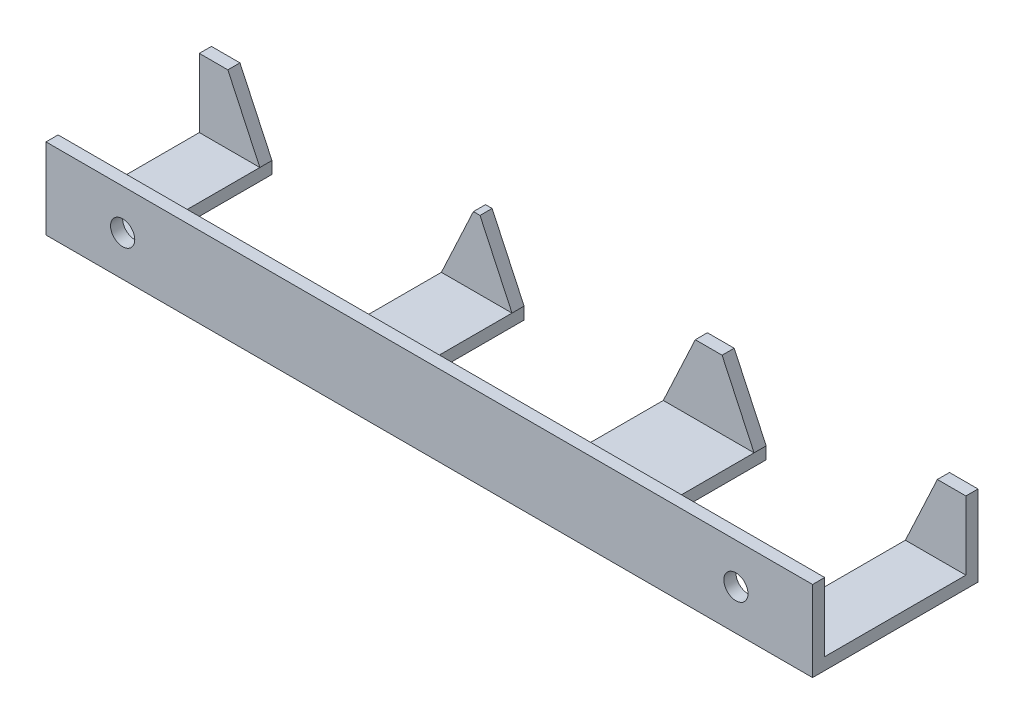
ISO-10303-21;
HEADER;
FILE_DESCRIPTION(('STEP AP214'),'2;1');
FILE_NAME('part.step','',(''),(''),'','','');
FILE_SCHEMA(('AUTOMOTIVE_DESIGN { 1 0 10303 214 1 1 1 1 }'));
ENDSEC;
DATA;
#1=APPLICATION_CONTEXT('core data for automotive mechanical design processes');
#2=APPLICATION_PROTOCOL_DEFINITION('international standard','automotive_design',2000,#1);
#3=PRODUCT_CONTEXT('',#1,'mechanical');
#4=PRODUCT('Part','Part','',(#3));
#5=PRODUCT_RELATED_PRODUCT_CATEGORY('part','',(#4));
#6=PRODUCT_DEFINITION_FORMATION('','',#4);
#7=PRODUCT_DEFINITION_CONTEXT('part definition',#1,'design');
#8=PRODUCT_DEFINITION('design','',#6,#7);
#9=PRODUCT_DEFINITION_SHAPE('','',#8);
#10=(LENGTH_UNIT() NAMED_UNIT(*) SI_UNIT(.MILLI.,.METRE.));
#11=(NAMED_UNIT(*) PLANE_ANGLE_UNIT() SI_UNIT($,.RADIAN.));
#12=(NAMED_UNIT(*) SI_UNIT($,.STERADIAN.) SOLID_ANGLE_UNIT());
#13=UNCERTAINTY_MEASURE_WITH_UNIT(LENGTH_MEASURE(1.E-05),#10,'distance_accuracy_value','');
#14=(GEOMETRIC_REPRESENTATION_CONTEXT(3) GLOBAL_UNCERTAINTY_ASSIGNED_CONTEXT((#13)) GLOBAL_UNIT_ASSIGNED_CONTEXT((#10,
#11,#12)) REPRESENTATION_CONTEXT('',''));
#15=CARTESIAN_POINT('',(0.,0.,0.));
#16=DIRECTION('',(0.,0.,1.));
#17=DIRECTION('',(1.,0.,0.));
#18=AXIS2_PLACEMENT_3D('',#15,#16,#17);
#19=CARTESIAN_POINT('',(-95.,10.,41.));
#20=DIRECTION('',(0.,-1.,0.));
#21=DIRECTION('',(0.,0.,-1.));
#22=AXIS2_PLACEMENT_3D('',#19,#20,#21);
#23=PLANE('',#22);
#24=DIRECTION('',(1.,0.,0.));
#25=VECTOR('',#24,1.);
#26=CARTESIAN_POINT('',(0.,10.,3.));
#27=LINE('',#26,#25);
#28=CARTESIAN_POINT('',(27.927230188635,10.,3.));
#29=VERTEX_POINT('',#28);
#30=CARTESIAN_POINT('',(34.572769811365,10.,3.));
#31=VERTEX_POINT('',#30);
#32=EDGE_CURVE('E454',#29,#31,#27,.T.);
#33=ORIENTED_EDGE('',*,*,#32,.T.);
#34=DIRECTION('',(0.,0.,-1.));
#35=VECTOR('',#34,1.);
#36=CARTESIAN_POINT('',(34.572769811365,10.,41.));
#37=LINE('',#36,#35);
#38=CARTESIAN_POINT('',(34.572769811365,10.,0.));
#39=VERTEX_POINT('',#38);
#40=EDGE_CURVE('E438',#31,#39,#37,.T.);
#41=ORIENTED_EDGE('',*,*,#40,.T.);
#42=DIRECTION('',(-1.,0.,0.));
#43=VECTOR('',#42,1.);
#44=CARTESIAN_POINT('',(-95.,10.,0.));
#45=LINE('',#44,#43);
#46=CARTESIAN_POINT('',(27.927230188635,10.,0.));
#47=VERTEX_POINT('',#46);
#48=EDGE_CURVE('E348',#39,#47,#45,.T.);
#49=ORIENTED_EDGE('',*,*,#48,.T.);
#50=DIRECTION('',(0.,0.,1.));
#51=VECTOR('',#50,1.);
#52=CARTESIAN_POINT('',(27.927230188635,10.,41.));
#53=LINE('',#52,#51);
#54=EDGE_CURVE('E407',#47,#29,#53,.T.);
#55=ORIENTED_EDGE('',*,*,#54,.T.);
#56=EDGE_LOOP('',(#33,#41,#49,#55));
#57=FACE_BOUND('',#56,.T.);
#58=ADVANCED_FACE('F33',(#57),#23,.F.);
#59=CARTESIAN_POINT('',(-27.0727698113651,10.,3.));
#60=VERTEX_POINT('',#59);
#61=CARTESIAN_POINT('',(-25.427230188635,10.,3.));
#62=VERTEX_POINT('',#61);
#63=EDGE_CURVE('E318',#60,#62,#27,.T.);
#64=ORIENTED_EDGE('',*,*,#63,.T.);
#65=DIRECTION('',(0.,0.,-1.));
#66=VECTOR('',#65,1.);
#67=CARTESIAN_POINT('',(-25.427230188635,10.,41.));
#68=LINE('',#67,#66);
#69=CARTESIAN_POINT('',(-25.427230188635,10.,0.));
#70=VERTEX_POINT('',#69);
#71=EDGE_CURVE('E429',#62,#70,#68,.T.);
#72=ORIENTED_EDGE('',*,*,#71,.T.);
#73=CARTESIAN_POINT('',(-27.0727698113651,10.,0.));
#74=VERTEX_POINT('',#73);
#75=EDGE_CURVE('E457',#70,#74,#45,.T.);
#76=ORIENTED_EDGE('',*,*,#75,.T.);
#77=DIRECTION('',(0.,0.,1.));
#78=VECTOR('',#77,1.);
#79=CARTESIAN_POINT('',(-27.0727698113651,10.,41.));
#80=LINE('',#79,#78);
#81=EDGE_CURVE('E398',#74,#60,#80,.T.);
#82=ORIENTED_EDGE('',*,*,#81,.T.);
#83=EDGE_LOOP('',(#64,#72,#76,#82));
#84=FACE_BOUND('',#83,.T.);
#85=ADVANCED_FACE('F524',(#84),#23,.F.);
#86=CARTESIAN_POINT('',(0.,0.,0.));
#87=DIRECTION('',(0.,0.,1.));
#88=DIRECTION('',(1.,0.,0.));
#89=AXIS2_PLACEMENT_3D('',#86,#87,#88);
#90=PLANE('',#89);
#91=ORIENTED_EDGE('',*,*,#48,.F.);
#92=DIRECTION('',(-0.422618261740696,0.906307787036652,0.));
#93=VECTOR('',#92,1.);
#94=CARTESIAN_POINT('',(34.572769811365,10.,0.));
#95=LINE('',#94,#93);
#96=CARTESIAN_POINT('',(42.5,-7.00000000000021,0.));
#97=VERTEX_POINT('',#96);
#98=EDGE_CURVE('E48',#39,#97,#95,.F.);
#99=ORIENTED_EDGE('',*,*,#98,.T.);
#100=DIRECTION('',(0.,1.,0.));
#101=VECTOR('',#100,1.);
#102=CARTESIAN_POINT('',(42.5,-10.,0.));
#103=LINE('',#102,#101);
#104=CARTESIAN_POINT('',(42.5,-10.,0.));
#105=VERTEX_POINT('',#104);
#106=EDGE_CURVE('E281',#105,#97,#103,.T.);
#107=ORIENTED_EDGE('',*,*,#106,.F.);
#108=DIRECTION('',(1.,0.,0.));
#109=VECTOR('',#108,1.);
#110=CARTESIAN_POINT('',(-95.,-10.,0.));
#111=LINE('',#110,#109);
#112=CARTESIAN_POINT('',(20.,-10.,0.));
#113=VERTEX_POINT('',#112);
#114=EDGE_CURVE('E354',#113,#105,#111,.T.);
#115=ORIENTED_EDGE('',*,*,#114,.F.);
#116=DIRECTION('',(0.,-1.,0.));
#117=VECTOR('',#116,1.);
#118=CARTESIAN_POINT('',(20.,-10.,0.));
#119=LINE('',#118,#117);
#120=CARTESIAN_POINT('',(20.,-7.00000000000015,0.));
#121=VERTEX_POINT('',#120);
#122=EDGE_CURVE('E243',#121,#113,#119,.T.);
#123=ORIENTED_EDGE('',*,*,#122,.F.);
#124=DIRECTION('',(-0.422618261740697,-0.906307787036651,0.));
#125=VECTOR('',#124,1.);
#126=CARTESIAN_POINT('',(20.,-7.00000000000015,0.));
#127=LINE('',#126,#125);
#128=EDGE_CURVE('E404',#121,#47,#127,.F.);
#129=ORIENTED_EDGE('',*,*,#128,.T.);
#130=EDGE_LOOP('',(#91,#99,#107,#115,#123,#129));
#131=FACE_BOUND('',#130,.T.);
#132=ADVANCED_FACE('F455',(#131),#90,.F.);
#133=ORIENTED_EDGE('',*,*,#75,.F.);
#134=DIRECTION('',(-0.422618261740697,0.906307787036651,0.));
#135=VECTOR('',#134,1.);
#136=CARTESIAN_POINT('',(-25.427230188635,10.,0.));
#137=LINE('',#136,#135);
#138=CARTESIAN_POINT('',(-17.5,-7.00000000000018,0.));
#139=VERTEX_POINT('',#138);
#140=EDGE_CURVE('E432',#70,#139,#137,.F.);
#141=ORIENTED_EDGE('',*,*,#140,.T.);
#142=DIRECTION('',(0.,1.,0.));
#143=VECTOR('',#142,1.);
#144=CARTESIAN_POINT('',(-17.5,-10.,0.));
#145=LINE('',#144,#143);
#146=CARTESIAN_POINT('',(-17.5,-10.,0.));
#147=VERTEX_POINT('',#146);
#148=EDGE_CURVE('E236',#147,#139,#145,.T.);
#149=ORIENTED_EDGE('',*,*,#148,.F.);
#150=CARTESIAN_POINT('',(-35.,-10.,0.));
#151=VERTEX_POINT('',#150);
#152=EDGE_CURVE('E353',#151,#147,#111,.T.);
#153=ORIENTED_EDGE('',*,*,#152,.F.);
#154=DIRECTION('',(0.,-1.,0.));
#155=VECTOR('',#154,1.);
#156=CARTESIAN_POINT('',(-35.,-10.,0.));
#157=LINE('',#156,#155);
#158=CARTESIAN_POINT('',(-35.,-7.00000000000012,0.));
#159=VERTEX_POINT('',#158);
#160=EDGE_CURVE('E270',#159,#151,#157,.T.);
#161=ORIENTED_EDGE('',*,*,#160,.F.);
#162=DIRECTION('',(-0.422618261740697,-0.906307787036651,0.));
#163=VECTOR('',#162,1.);
#164=CARTESIAN_POINT('',(-35.,-7.00000000000012,0.));
#165=LINE('',#164,#163);
#166=EDGE_CURVE('E395',#159,#74,#165,.F.);
#167=ORIENTED_EDGE('',*,*,#166,.T.);
#168=EDGE_LOOP('',(#133,#141,#149,#153,#161,#167));
#169=FACE_BOUND('',#168,.T.);
#170=ADVANCED_FACE('F549',(#169),#90,.F.);
#171=CARTESIAN_POINT('',(0.,-7.,3.));
#172=DIRECTION('',(0.,0.,1.));
#173=DIRECTION('',(1.,0.,0.));
#174=AXIS2_PLACEMENT_3D('',#171,#172,#173);
#175=PLANE('',#174);
#176=DIRECTION('',(1.,0.,0.));
#177=VECTOR('',#176,1.);
#178=CARTESIAN_POINT('',(0.,-7.,3.));
#179=LINE('',#178,#177);
#180=CARTESIAN_POINT('',(20.,-7.,3.));
#181=VERTEX_POINT('',#180);
#182=CARTESIAN_POINT('',(42.5,-7.,3.));
#183=VERTEX_POINT('',#182);
#184=EDGE_CURVE('E313',#181,#183,#179,.T.);
#185=ORIENTED_EDGE('',*,*,#184,.T.);
#186=DIRECTION('',(0.422618261740696,-0.906307787036652,0.));
#187=VECTOR('',#186,1.);
#188=CARTESIAN_POINT('',(34.909236705839,9.27844441627814,3.));
#189=LINE('',#188,#187);
#190=EDGE_CURVE('E11',#183,#31,#189,.F.);
#191=ORIENTED_EDGE('',*,*,#190,.T.);
#192=ORIENTED_EDGE('',*,*,#32,.F.);
#193=DIRECTION('',(0.422618261740697,0.906307787036651,0.));
#194=VECTOR('',#193,1.);
#195=CARTESIAN_POINT('',(16.4278760968655,-14.6604444311898,3.));
#196=LINE('',#195,#194);
#197=EDGE_CURVE('E409',#29,#181,#196,.F.);
#198=ORIENTED_EDGE('',*,*,#197,.T.);
#199=EDGE_LOOP('',(#185,#191,#192,#198));
#200=FACE_BOUND('',#199,.T.);
#201=ADVANCED_FACE('F447',(#200),#175,.T.);
#202=CARTESIAN_POINT('',(-35.,-7.,3.));
#203=VERTEX_POINT('',#202);
#204=CARTESIAN_POINT('',(-17.5,-7.,3.));
#205=VERTEX_POINT('',#204);
#206=EDGE_CURVE('E312',#203,#205,#179,.T.);
#207=ORIENTED_EDGE('',*,*,#206,.T.);
#208=DIRECTION('',(0.422618261740697,-0.906307787036651,0.));
#209=VECTOR('',#208,1.);
#210=CARTESIAN_POINT('',(-14.3743915847573,-13.7028888772911,3.));
#211=LINE('',#210,#209);
#212=EDGE_CURVE('E436',#205,#62,#211,.F.);
#213=ORIENTED_EDGE('',*,*,#212,.T.);
#214=ORIENTED_EDGE('',*,*,#63,.F.);
#215=DIRECTION('',(0.422618261740697,0.906307787036651,0.));
#216=VECTOR('',#215,1.);
#217=CARTESIAN_POINT('',(-28.7487831695145,6.40577775458203,3.));
#218=LINE('',#217,#216);
#219=EDGE_CURVE('E400',#60,#203,#218,.F.);
#220=ORIENTED_EDGE('',*,*,#219,.T.);
#221=EDGE_LOOP('',(#207,#213,#214,#220));
#222=FACE_BOUND('',#221,.T.);
#223=ADVANCED_FACE('F522',(#222),#175,.T.);
#224=CARTESIAN_POINT('',(0.,-7.,0.));
#225=DIRECTION('',(0.,1.,0.));
#226=DIRECTION('',(0.,0.,1.));
#227=AXIS2_PLACEMENT_3D('',#224,#225,#226);
#228=PLANE('',#227);
#229=DIRECTION('',(0.,0.,-1.));
#230=VECTOR('',#229,1.);
#231=CARTESIAN_POINT('',(20.,-7.,0.));
#232=LINE('',#231,#230);
#233=CARTESIAN_POINT('',(20.,-7.,38.));
#234=VERTEX_POINT('',#233);
#235=EDGE_CURVE('E383',#234,#181,#232,.T.);
#236=ORIENTED_EDGE('',*,*,#235,.F.);
#237=DIRECTION('',(1.,0.,0.));
#238=VECTOR('',#237,1.);
#239=CARTESIAN_POINT('',(0.,-7.,38.));
#240=LINE('',#239,#238);
#241=CARTESIAN_POINT('',(42.5,-7.,38.));
#242=VERTEX_POINT('',#241);
#243=EDGE_CURVE('E232',#234,#242,#240,.T.);
#244=ORIENTED_EDGE('',*,*,#243,.T.);
#245=DIRECTION('',(0.,0.,1.));
#246=VECTOR('',#245,1.);
#247=CARTESIAN_POINT('',(42.5,-7.,0.));
#248=LINE('',#247,#246);
#249=EDGE_CURVE('E368',#183,#242,#248,.T.);
#250=ORIENTED_EDGE('',*,*,#249,.F.);
#251=ORIENTED_EDGE('',*,*,#184,.F.);
#252=EDGE_LOOP('',(#236,#244,#250,#251));
#253=FACE_BOUND('',#252,.T.);
#254=ADVANCED_FACE('F451',(#253),#228,.T.);
#255=DIRECTION('',(0.,0.,1.));
#256=VECTOR('',#255,1.);
#257=CARTESIAN_POINT('',(-17.5,-7.,0.));
#258=LINE('',#257,#256);
#259=CARTESIAN_POINT('',(-17.5,-7.,38.));
#260=VERTEX_POINT('',#259);
#261=EDGE_CURVE('E380',#205,#260,#258,.T.);
#262=ORIENTED_EDGE('',*,*,#261,.F.);
#263=ORIENTED_EDGE('',*,*,#206,.F.);
#264=DIRECTION('',(0.,0.,-1.));
#265=VECTOR('',#264,1.);
#266=CARTESIAN_POINT('',(-35.,-7.,0.));
#267=LINE('',#266,#265);
#268=CARTESIAN_POINT('',(-35.,-7.,38.));
#269=VERTEX_POINT('',#268);
#270=EDGE_CURVE('E377',#269,#203,#267,.T.);
#271=ORIENTED_EDGE('',*,*,#270,.F.);
#272=EDGE_CURVE('E304',#269,#260,#240,.T.);
#273=ORIENTED_EDGE('',*,*,#272,.T.);
#274=EDGE_LOOP('',(#262,#263,#271,#273));
#275=FACE_BOUND('',#274,.T.);
#276=ADVANCED_FACE('F507',(#275),#228,.T.);
#277=CARTESIAN_POINT('',(95.,10.,0.));
#278=VERTEX_POINT('',#277);
#279=CARTESIAN_POINT('',(87.927230188635,10.,0.));
#280=VERTEX_POINT('',#279);
#281=EDGE_CURVE('E344',#278,#280,#45,.T.);
#282=ORIENTED_EDGE('',*,*,#281,.T.);
#283=DIRECTION('',(0.,0.,1.));
#284=VECTOR('',#283,1.);
#285=CARTESIAN_POINT('',(87.927230188635,10.,41.));
#286=LINE('',#285,#284);
#287=CARTESIAN_POINT('',(87.927230188635,10.,3.));
#288=VERTEX_POINT('',#287);
#289=EDGE_CURVE('E416',#280,#288,#286,.T.);
#290=ORIENTED_EDGE('',*,*,#289,.T.);
#291=CARTESIAN_POINT('',(95.,10.,3.));
#292=VERTEX_POINT('',#291);
#293=EDGE_CURVE('E315',#288,#292,#27,.T.);
#294=ORIENTED_EDGE('',*,*,#293,.T.);
#295=DIRECTION('',(0.,0.,-1.));
#296=VECTOR('',#295,1.);
#297=CARTESIAN_POINT('',(95.,10.,41.));
#298=LINE('',#297,#296);
#299=EDGE_CURVE('E364',#292,#278,#298,.T.);
#300=ORIENTED_EDGE('',*,*,#299,.T.);
#301=EDGE_LOOP('',(#282,#290,#294,#300));
#302=FACE_BOUND('',#301,.T.);
#303=ADVANCED_FACE('F528',(#302),#23,.F.);
#304=DIRECTION('',(0.,-1.,0.));
#305=VECTOR('',#304,1.);
#306=CARTESIAN_POINT('',(80.,-10.,0.));
#307=LINE('',#306,#305);
#308=CARTESIAN_POINT('',(80.,-7.00000000000012,0.));
#309=VERTEX_POINT('',#308);
#310=CARTESIAN_POINT('',(80.,-10.,0.));
#311=VERTEX_POINT('',#310);
#312=EDGE_CURVE('E259',#309,#311,#307,.T.);
#313=ORIENTED_EDGE('',*,*,#312,.F.);
#314=DIRECTION('',(-0.422618261740697,-0.906307787036651,0.));
#315=VECTOR('',#314,1.);
#316=CARTESIAN_POINT('',(80.,-7.00000000000012,0.));
#317=LINE('',#316,#315);
#318=EDGE_CURVE('E414',#309,#280,#317,.F.);
#319=ORIENTED_EDGE('',*,*,#318,.T.);
#320=ORIENTED_EDGE('',*,*,#281,.F.);
#321=DIRECTION('',(0.,1.,0.));
#322=VECTOR('',#321,1.);
#323=CARTESIAN_POINT('',(95.,10.,0.));
#324=LINE('',#323,#322);
#325=CARTESIAN_POINT('',(95.,-10.,0.));
#326=VERTEX_POINT('',#325);
#327=EDGE_CURVE('E322',#326,#278,#324,.T.);
#328=ORIENTED_EDGE('',*,*,#327,.F.);
#329=EDGE_CURVE('E350',#311,#326,#111,.T.);
#330=ORIENTED_EDGE('',*,*,#329,.F.);
#331=EDGE_LOOP('',(#313,#319,#320,#328,#330));
#332=FACE_BOUND('',#331,.T.);
#333=ADVANCED_FACE('F538',(#332),#90,.F.);
#334=ORIENTED_EDGE('',*,*,#293,.F.);
#335=DIRECTION('',(0.422618261740697,0.906307787036651,0.));
#336=VECTOR('',#335,1.);
#337=CARTESIAN_POINT('',(65.7115043874617,-37.641777724759,3.));
#338=LINE('',#337,#336);
#339=CARTESIAN_POINT('',(80.,-7.,3.));
#340=VERTEX_POINT('',#339);
#341=EDGE_CURVE('E418',#288,#340,#338,.F.);
#342=ORIENTED_EDGE('',*,*,#341,.T.);
#343=CARTESIAN_POINT('',(95.,-7.,3.));
#344=VERTEX_POINT('',#343);
#345=EDGE_CURVE('E307',#340,#344,#179,.T.);
#346=ORIENTED_EDGE('',*,*,#345,.T.);
#347=DIRECTION('',(0.,1.,0.));
#348=VECTOR('',#347,1.);
#349=CARTESIAN_POINT('',(95.,-7.,3.));
#350=LINE('',#349,#348);
#351=EDGE_CURVE('E323',#344,#292,#350,.T.);
#352=ORIENTED_EDGE('',*,*,#351,.T.);
#353=EDGE_LOOP('',(#334,#342,#346,#352));
#354=FACE_BOUND('',#353,.T.);
#355=ADVANCED_FACE('F533',(#354),#175,.T.);
#356=DIRECTION('',(0.,0.,-1.));
#357=VECTOR('',#356,1.);
#358=CARTESIAN_POINT('',(80.,-7.,0.));
#359=LINE('',#358,#357);
#360=CARTESIAN_POINT('',(80.,-7.,38.));
#361=VERTEX_POINT('',#360);
#362=EDGE_CURVE('E371',#361,#340,#359,.T.);
#363=ORIENTED_EDGE('',*,*,#362,.F.);
#364=CARTESIAN_POINT('',(95.,-7.,38.));
#365=VERTEX_POINT('',#364);
#366=EDGE_CURVE('E298',#361,#365,#240,.T.);
#367=ORIENTED_EDGE('',*,*,#366,.T.);
#368=DIRECTION('',(0.,0.,-1.));
#369=VECTOR('',#368,1.);
#370=CARTESIAN_POINT('',(95.,-7.,0.));
#371=LINE('',#370,#369);
#372=EDGE_CURVE('E303',#365,#344,#371,.T.);
#373=ORIENTED_EDGE('',*,*,#372,.T.);
#374=ORIENTED_EDGE('',*,*,#345,.F.);
#375=EDGE_LOOP('',(#363,#367,#373,#374));
#376=FACE_BOUND('',#375,.T.);
#377=ADVANCED_FACE('F500',(#376),#228,.T.);
#378=CARTESIAN_POINT('',(95.,10.,41.));
#379=DIRECTION('',(-1.,0.,0.));
#380=DIRECTION('',(0.,0.,1.));
#381=AXIS2_PLACEMENT_3D('',#378,#379,#380);
#382=PLANE('',#381);
#383=ORIENTED_EDGE('',*,*,#351,.F.);
#384=ORIENTED_EDGE('',*,*,#372,.F.);
#385=DIRECTION('',(0.,1.,0.));
#386=VECTOR('',#385,1.);
#387=CARTESIAN_POINT('',(95.,-7.,38.));
#388=LINE('',#387,#386);
#389=CARTESIAN_POINT('',(95.,10.,38.));
#390=VERTEX_POINT('',#389);
#391=EDGE_CURVE('E326',#365,#390,#388,.T.);
#392=ORIENTED_EDGE('',*,*,#391,.T.);
#393=CARTESIAN_POINT('',(95.,10.,41.));
#394=VERTEX_POINT('',#393);
#395=EDGE_CURVE('E365',#394,#390,#298,.T.);
#396=ORIENTED_EDGE('',*,*,#395,.F.);
#397=DIRECTION('',(0.,1.,0.));
#398=VECTOR('',#397,1.);
#399=CARTESIAN_POINT('',(95.,10.,41.));
#400=LINE('',#399,#398);
#401=CARTESIAN_POINT('',(95.,-10.,41.));
#402=VERTEX_POINT('',#401);
#403=EDGE_CURVE('E330',#402,#394,#400,.T.);
#404=ORIENTED_EDGE('',*,*,#403,.F.);
#405=DIRECTION('',(0.,0.,-1.));
#406=VECTOR('',#405,1.);
#407=CARTESIAN_POINT('',(95.,-10.,41.));
#408=LINE('',#407,#406);
#409=EDGE_CURVE('E340',#402,#326,#408,.T.);
#410=ORIENTED_EDGE('',*,*,#409,.T.);
#411=ORIENTED_EDGE('',*,*,#327,.T.);
#412=ORIENTED_EDGE('',*,*,#299,.F.);
#413=EDGE_LOOP('',(#383,#384,#392,#396,#404,#410,#411,#412));
#414=FACE_BOUND('',#413,.T.);
#415=ADVANCED_FACE('F495',(#414),#382,.F.);
#416=CARTESIAN_POINT('',(-95.,10.,3.));
#417=VERTEX_POINT('',#416);
#418=CARTESIAN_POINT('',(-87.927230188635,10.,3.));
#419=VERTEX_POINT('',#418);
#420=EDGE_CURVE('E299',#417,#419,#27,.T.);
#421=ORIENTED_EDGE('',*,*,#420,.T.);
#422=DIRECTION('',(0.,0.,-1.));
#423=VECTOR('',#422,1.);
#424=CARTESIAN_POINT('',(-87.927230188635,10.,41.));
#425=LINE('',#424,#423);
#426=CARTESIAN_POINT('',(-87.927230188635,10.,0.));
#427=VERTEX_POINT('',#426);
#428=EDGE_CURVE('E420',#419,#427,#425,.T.);
#429=ORIENTED_EDGE('',*,*,#428,.T.);
#430=CARTESIAN_POINT('',(-95.,10.,0.));
#431=VERTEX_POINT('',#430);
#432=EDGE_CURVE('E343',#427,#431,#45,.T.);
#433=ORIENTED_EDGE('',*,*,#432,.T.);
#434=DIRECTION('',(0.,0.,-1.));
#435=VECTOR('',#434,1.);
#436=CARTESIAN_POINT('',(-95.,10.,41.));
#437=LINE('',#436,#435);
#438=EDGE_CURVE('E360',#417,#431,#437,.T.);
#439=ORIENTED_EDGE('',*,*,#438,.F.);
#440=EDGE_LOOP('',(#421,#429,#433,#439));
#441=FACE_BOUND('',#440,.T.);
#442=ADVANCED_FACE('F464',(#441),#23,.F.);
#443=CARTESIAN_POINT('',(-95.,10.,41.));
#444=DIRECTION('',(1.,0.,0.));
#445=DIRECTION('',(0.,0.,-1.));
#446=AXIS2_PLACEMENT_3D('',#443,#444,#445);
#447=PLANE('',#446);
#448=DIRECTION('',(0.,1.,0.));
#449=VECTOR('',#448,1.);
#450=CARTESIAN_POINT('',(-95.,-7.,3.));
#451=LINE('',#450,#449);
#452=CARTESIAN_POINT('',(-95.,-7.,3.));
#453=VERTEX_POINT('',#452);
#454=EDGE_CURVE('E319',#453,#417,#451,.T.);
#455=ORIENTED_EDGE('',*,*,#454,.T.);
#456=ORIENTED_EDGE('',*,*,#438,.T.);
#457=DIRECTION('',(0.,-1.,0.));
#458=VECTOR('',#457,1.);
#459=CARTESIAN_POINT('',(-95.,10.,0.));
#460=LINE('',#459,#458);
#461=CARTESIAN_POINT('',(-95.,-10.,0.));
#462=VERTEX_POINT('',#461);
#463=EDGE_CURVE('E347',#431,#462,#460,.T.);
#464=ORIENTED_EDGE('',*,*,#463,.T.);
#465=DIRECTION('',(0.,0.,-1.));
#466=VECTOR('',#465,1.);
#467=CARTESIAN_POINT('',(-95.,-10.,41.));
#468=LINE('',#467,#466);
#469=CARTESIAN_POINT('',(-95.,-10.,41.));
#470=VERTEX_POINT('',#469);
#471=EDGE_CURVE('E357',#470,#462,#468,.T.);
#472=ORIENTED_EDGE('',*,*,#471,.F.);
#473=DIRECTION('',(0.,-1.,0.));
#474=VECTOR('',#473,1.);
#475=CARTESIAN_POINT('',(-95.,10.,41.));
#476=LINE('',#475,#474);
#477=CARTESIAN_POINT('',(-95.,10.,41.));
#478=VERTEX_POINT('',#477);
#479=EDGE_CURVE('E336',#478,#470,#476,.T.);
#480=ORIENTED_EDGE('',*,*,#479,.F.);
#481=CARTESIAN_POINT('',(-95.,10.,38.));
#482=VERTEX_POINT('',#481);
#483=EDGE_CURVE('E361',#478,#482,#437,.T.);
#484=ORIENTED_EDGE('',*,*,#483,.T.);
#485=DIRECTION('',(0.,1.,0.));
#486=VECTOR('',#485,1.);
#487=CARTESIAN_POINT('',(-95.,-7.,38.));
#488=LINE('',#487,#486);
#489=CARTESIAN_POINT('',(-95.,-7.,38.));
#490=VERTEX_POINT('',#489);
#491=EDGE_CURVE('E311',#490,#482,#488,.T.);
#492=ORIENTED_EDGE('',*,*,#491,.F.);
#493=DIRECTION('',(0.,0.,1.));
#494=VECTOR('',#493,1.);
#495=CARTESIAN_POINT('',(-95.,-7.,0.));
#496=LINE('',#495,#494);
#497=EDGE_CURVE('E295',#453,#490,#496,.T.);
#498=ORIENTED_EDGE('',*,*,#497,.F.);
#499=EDGE_LOOP('',(#455,#456,#464,#472,#480,#484,#492,#498));
#500=FACE_BOUND('',#499,.T.);
#501=ADVANCED_FACE('F469',(#500),#447,.F.);
#502=ORIENTED_EDGE('',*,*,#395,.T.);
#503=DIRECTION('',(1.,0.,0.));
#504=VECTOR('',#503,1.);
#505=CARTESIAN_POINT('',(0.,10.,38.));
#506=LINE('',#505,#504);
#507=EDGE_CURVE('E292',#482,#390,#506,.T.);
#508=ORIENTED_EDGE('',*,*,#507,.F.);
#509=ORIENTED_EDGE('',*,*,#483,.F.);
#510=DIRECTION('',(-1.,0.,0.));
#511=VECTOR('',#510,1.);
#512=CARTESIAN_POINT('',(-95.,10.,41.));
#513=LINE('',#512,#511);
#514=EDGE_CURVE('E333',#394,#478,#513,.T.);
#515=ORIENTED_EDGE('',*,*,#514,.F.);
#516=EDGE_LOOP('',(#502,#508,#509,#515));
#517=FACE_BOUND('',#516,.T.);
#518=ADVANCED_FACE('F489',(#517),#23,.F.);
#519=CARTESIAN_POINT('',(-95.,-10.,41.));
#520=DIRECTION('',(0.,1.,0.));
#521=DIRECTION('',(0.,0.,1.));
#522=AXIS2_PLACEMENT_3D('',#519,#520,#521);
#523=PLANE('',#522);
#524=DIRECTION('',(-1.,0.,0.));
#525=VECTOR('',#524,1.);
#526=CARTESIAN_POINT('',(20.,-10.,38.));
#527=LINE('',#526,#525);
#528=CARTESIAN_POINT('',(20.,-10.,38.));
#529=VERTEX_POINT('',#528);
#530=CARTESIAN_POINT('',(-17.5,-10.,38.));
#531=VERTEX_POINT('',#530);
#532=EDGE_CURVE('E229',#529,#531,#527,.T.);
#533=ORIENTED_EDGE('',*,*,#532,.F.);
#534=DIRECTION('',(0.,0.,-1.));
#535=VECTOR('',#534,1.);
#536=CARTESIAN_POINT('',(20.,-10.,38.));
#537=LINE('',#536,#535);
#538=EDGE_CURVE('E239',#529,#113,#537,.T.);
#539=ORIENTED_EDGE('',*,*,#538,.T.);
#540=ORIENTED_EDGE('',*,*,#114,.T.);
#541=DIRECTION('',(0.,0.,-1.));
#542=VECTOR('',#541,1.);
#543=CARTESIAN_POINT('',(42.5,-10.,38.));
#544=LINE('',#543,#542);
#545=CARTESIAN_POINT('',(42.5,-10.,38.));
#546=VERTEX_POINT('',#545);
#547=EDGE_CURVE('E289',#546,#105,#544,.T.);
#548=ORIENTED_EDGE('',*,*,#547,.F.);
#549=DIRECTION('',(-1.,0.,0.));
#550=VECTOR('',#549,1.);
#551=CARTESIAN_POINT('',(80.,-10.,38.));
#552=LINE('',#551,#550);
#553=CARTESIAN_POINT('',(80.,-10.,38.));
#554=VERTEX_POINT('',#553);
#555=EDGE_CURVE('E280',#554,#546,#552,.T.);
#556=ORIENTED_EDGE('',*,*,#555,.F.);
#557=DIRECTION('',(0.,0.,-1.));
#558=VECTOR('',#557,1.);
#559=CARTESIAN_POINT('',(80.,-10.,38.));
#560=LINE('',#559,#558);
#561=EDGE_CURVE('E286',#554,#311,#560,.T.);
#562=ORIENTED_EDGE('',*,*,#561,.T.);
#563=ORIENTED_EDGE('',*,*,#329,.T.);
#564=ORIENTED_EDGE('',*,*,#409,.F.);
#565=DIRECTION('',(1.,0.,0.));
#566=VECTOR('',#565,1.);
#567=CARTESIAN_POINT('',(-95.,-10.,41.));
#568=LINE('',#567,#566);
#569=EDGE_CURVE('E338',#470,#402,#568,.T.);
#570=ORIENTED_EDGE('',*,*,#569,.F.);
#571=ORIENTED_EDGE('',*,*,#471,.T.);
#572=CARTESIAN_POINT('',(-80.,-10.,0.));
#573=VERTEX_POINT('',#572);
#574=EDGE_CURVE('E334',#462,#573,#111,.T.);
#575=ORIENTED_EDGE('',*,*,#574,.T.);
#576=DIRECTION('',(0.,0.,-1.));
#577=VECTOR('',#576,1.);
#578=CARTESIAN_POINT('',(-80.,-10.,38.));
#579=LINE('',#578,#577);
#580=CARTESIAN_POINT('',(-80.,-10.,38.));
#581=VERTEX_POINT('',#580);
#582=EDGE_CURVE('E256',#581,#573,#579,.T.);
#583=ORIENTED_EDGE('',*,*,#582,.F.);
#584=DIRECTION('',(-1.,0.,0.));
#585=VECTOR('',#584,1.);
#586=CARTESIAN_POINT('',(-35.,-10.,38.));
#587=LINE('',#586,#585);
#588=CARTESIAN_POINT('',(-35.,-10.,38.));
#589=VERTEX_POINT('',#588);
#590=EDGE_CURVE('E263',#589,#581,#587,.T.);
#591=ORIENTED_EDGE('',*,*,#590,.F.);
#592=DIRECTION('',(0.,0.,-1.));
#593=VECTOR('',#592,1.);
#594=CARTESIAN_POINT('',(-35.,-10.,38.));
#595=LINE('',#594,#593);
#596=EDGE_CURVE('E269',#589,#151,#595,.T.);
#597=ORIENTED_EDGE('',*,*,#596,.T.);
#598=ORIENTED_EDGE('',*,*,#152,.T.);
#599=DIRECTION('',(0.,0.,-1.));
#600=VECTOR('',#599,1.);
#601=CARTESIAN_POINT('',(-17.5,-10.,38.));
#602=LINE('',#601,#600);
#603=EDGE_CURVE('E246',#531,#147,#602,.T.);
#604=ORIENTED_EDGE('',*,*,#603,.F.);
#605=EDGE_LOOP('',(#533,#539,#540,#548,#556,#562,#563,#564,#570,#571,#575,#583,#591,#597,#598,#604));
#606=FACE_BOUND('',#605,.T.);
#607=ADVANCED_FACE('F249',(#606),#523,.F.);
#608=CARTESIAN_POINT('',(0.,0.,41.));
#609=DIRECTION('',(0.,0.,1.));
#610=DIRECTION('',(1.,0.,0.));
#611=AXIS2_PLACEMENT_3D('',#608,#609,#610);
#612=PLANE('',#611);
#613=CARTESIAN_POINT('',(-76.,0.,41.));
#614=DIRECTION('',(0.,0.,1.));
#615=DIRECTION('',(1.,0.,0.));
#616=AXIS2_PLACEMENT_3D('',#613,#614,#615);
#617=CIRCLE('',#616,3.);
#618=CARTESIAN_POINT('',(-73.,0.,41.));
#619=VERTEX_POINT('',#618);
#620=EDGE_CURVE('E392',#619,#619,#617,.T.);
#621=ORIENTED_EDGE('',*,*,#620,.F.);
#622=EDGE_LOOP('',(#621));
#623=FACE_BOUND('',#622,.T.);
#624=CARTESIAN_POINT('',(76.,0.,41.));
#625=DIRECTION('',(0.,0.,1.));
#626=DIRECTION('',(1.,0.,0.));
#627=AXIS2_PLACEMENT_3D('',#624,#625,#626);
#628=CIRCLE('',#627,3.);
#629=CARTESIAN_POINT('',(79.,0.,41.));
#630=VERTEX_POINT('',#629);
#631=EDGE_CURVE('E388',#630,#630,#628,.T.);
#632=ORIENTED_EDGE('',*,*,#631,.F.);
#633=EDGE_LOOP('',(#632));
#634=FACE_BOUND('',#633,.T.);
#635=ORIENTED_EDGE('',*,*,#403,.T.);
#636=ORIENTED_EDGE('',*,*,#514,.T.);
#637=ORIENTED_EDGE('',*,*,#479,.T.);
#638=ORIENTED_EDGE('',*,*,#569,.T.);
#639=EDGE_LOOP('',(#635,#636,#637,#638));
#640=FACE_BOUND('',#639,.T.);
#641=ADVANCED_FACE('F484',(#623,#634,#640),#612,.T.);
#642=ORIENTED_EDGE('',*,*,#432,.F.);
#643=DIRECTION('',(-0.422618261740697,0.906307787036651,0.));
#644=VECTOR('',#643,1.);
#645=CARTESIAN_POINT('',(-87.927230188635,10.,0.));
#646=LINE('',#645,#644);
#647=CARTESIAN_POINT('',(-80.,-7.00000000000012,0.));
#648=VERTEX_POINT('',#647);
#649=EDGE_CURVE('E423',#427,#648,#646,.F.);
#650=ORIENTED_EDGE('',*,*,#649,.T.);
#651=DIRECTION('',(0.,1.,0.));
#652=VECTOR('',#651,1.);
#653=CARTESIAN_POINT('',(-80.,-10.,0.));
#654=LINE('',#653,#652);
#655=EDGE_CURVE('E264',#573,#648,#654,.T.);
#656=ORIENTED_EDGE('',*,*,#655,.F.);
#657=ORIENTED_EDGE('',*,*,#574,.F.);
#658=ORIENTED_EDGE('',*,*,#463,.F.);
#659=EDGE_LOOP('',(#642,#650,#656,#657,#658));
#660=FACE_BOUND('',#659,.T.);
#661=ADVANCED_FACE('F474',(#660),#90,.F.);
#662=CARTESIAN_POINT('',(-80.,-7.,3.));
#663=VERTEX_POINT('',#662);
#664=EDGE_CURVE('E308',#453,#663,#179,.T.);
#665=ORIENTED_EDGE('',*,*,#664,.T.);
#666=DIRECTION('',(0.422618261740697,-0.906307787036651,0.));
#667=VECTOR('',#666,1.);
#668=CARTESIAN_POINT('',(-65.7115043874618,-37.641777724759,3.));
#669=LINE('',#668,#667);
#670=EDGE_CURVE('E427',#663,#419,#669,.F.);
#671=ORIENTED_EDGE('',*,*,#670,.T.);
#672=ORIENTED_EDGE('',*,*,#420,.F.);
#673=ORIENTED_EDGE('',*,*,#454,.F.);
#674=EDGE_LOOP('',(#665,#671,#672,#673));
#675=FACE_BOUND('',#674,.T.);
#676=ADVANCED_FACE('F563',(#675),#175,.T.);
#677=CARTESIAN_POINT('',(0.,-7.,38.));
#678=DIRECTION('',(0.,0.,1.));
#679=DIRECTION('',(1.,0.,0.));
#680=AXIS2_PLACEMENT_3D('',#677,#678,#679);
#681=PLANE('',#680);
#682=CARTESIAN_POINT('',(-76.,0.,38.));
#683=DIRECTION('',(0.,0.,1.));
#684=DIRECTION('',(1.,0.,0.));
#685=AXIS2_PLACEMENT_3D('',#682,#683,#684);
#686=CIRCLE('',#685,3.);
#687=CARTESIAN_POINT('',(-73.,0.,38.));
#688=VERTEX_POINT('',#687);
#689=EDGE_CURVE('E389',#688,#688,#686,.T.);
#690=ORIENTED_EDGE('',*,*,#689,.T.);
#691=EDGE_LOOP('',(#690));
#692=FACE_BOUND('',#691,.T.);
#693=CARTESIAN_POINT('',(76.,0.,38.));
#694=DIRECTION('',(0.,0.,1.));
#695=DIRECTION('',(1.,0.,0.));
#696=AXIS2_PLACEMENT_3D('',#693,#694,#695);
#697=CIRCLE('',#696,3.);
#698=CARTESIAN_POINT('',(79.,0.,38.));
#699=VERTEX_POINT('',#698);
#700=EDGE_CURVE('E272',#699,#699,#697,.T.);
#701=ORIENTED_EDGE('',*,*,#700,.T.);
#702=EDGE_LOOP('',(#701));
#703=FACE_BOUND('',#702,.T.);
#704=ORIENTED_EDGE('',*,*,#507,.T.);
#705=ORIENTED_EDGE('',*,*,#391,.F.);
#706=ORIENTED_EDGE('',*,*,#366,.F.);
#707=DIRECTION('',(0.,-1.,0.));
#708=VECTOR('',#707,1.);
#709=CARTESIAN_POINT('',(80.,-10.,38.));
#710=LINE('',#709,#708);
#711=EDGE_CURVE('E278',#361,#554,#710,.T.);
#712=ORIENTED_EDGE('',*,*,#711,.T.);
#713=ORIENTED_EDGE('',*,*,#555,.T.);
#714=DIRECTION('',(0.,1.,0.));
#715=VECTOR('',#714,1.);
#716=CARTESIAN_POINT('',(42.5,-10.,38.));
#717=LINE('',#716,#715);
#718=EDGE_CURVE('E284',#546,#242,#717,.T.);
#719=ORIENTED_EDGE('',*,*,#718,.T.);
#720=ORIENTED_EDGE('',*,*,#243,.F.);
#721=DIRECTION('',(0.,-1.,0.));
#722=VECTOR('',#721,1.);
#723=CARTESIAN_POINT('',(20.,-10.,38.));
#724=LINE('',#723,#722);
#725=EDGE_CURVE('E225',#234,#529,#724,.T.);
#726=ORIENTED_EDGE('',*,*,#725,.T.);
#727=ORIENTED_EDGE('',*,*,#532,.T.);
#728=DIRECTION('',(0.,1.,0.));
#729=VECTOR('',#728,1.);
#730=CARTESIAN_POINT('',(-17.5,-10.,38.));
#731=LINE('',#730,#729);
#732=EDGE_CURVE('E247',#531,#260,#731,.T.);
#733=ORIENTED_EDGE('',*,*,#732,.T.);
#734=ORIENTED_EDGE('',*,*,#272,.F.);
#735=DIRECTION('',(0.,-1.,0.));
#736=VECTOR('',#735,1.);
#737=CARTESIAN_POINT('',(-35.,-10.,38.));
#738=LINE('',#737,#736);
#739=EDGE_CURVE('E261',#269,#589,#738,.T.);
#740=ORIENTED_EDGE('',*,*,#739,.T.);
#741=ORIENTED_EDGE('',*,*,#590,.T.);
#742=DIRECTION('',(0.,1.,0.));
#743=VECTOR('',#742,1.);
#744=CARTESIAN_POINT('',(-80.,-10.,38.));
#745=LINE('',#744,#743);
#746=CARTESIAN_POINT('',(-80.,-7.,38.));
#747=VERTEX_POINT('',#746);
#748=EDGE_CURVE('E267',#581,#747,#745,.T.);
#749=ORIENTED_EDGE('',*,*,#748,.T.);
#750=EDGE_CURVE('E300',#490,#747,#240,.T.);
#751=ORIENTED_EDGE('',*,*,#750,.F.);
#752=ORIENTED_EDGE('',*,*,#491,.T.);
#753=EDGE_LOOP('',(#704,#705,#706,#712,#713,#719,#720,#726,#727,#733,#734,#740,#741,#749,#751,#752));
#754=FACE_BOUND('',#753,.T.);
#755=ADVANCED_FACE('F227',(#692,#703,#754),#681,.F.);
#756=DIRECTION('',(0.,0.,1.));
#757=VECTOR('',#756,1.);
#758=CARTESIAN_POINT('',(-80.,-7.,0.));
#759=LINE('',#758,#757);
#760=EDGE_CURVE('E374',#663,#747,#759,.T.);
#761=ORIENTED_EDGE('',*,*,#760,.F.);
#762=ORIENTED_EDGE('',*,*,#664,.F.);
#763=ORIENTED_EDGE('',*,*,#497,.T.);
#764=ORIENTED_EDGE('',*,*,#750,.T.);
#765=EDGE_LOOP('',(#761,#762,#763,#764));
#766=FACE_BOUND('',#765,.T.);
#767=ADVANCED_FACE('F560',(#766),#228,.T.);
#768=CARTESIAN_POINT('',(80.,-10.,38.));
#769=DIRECTION('',(1.,0.,0.));
#770=DIRECTION('',(0.,0.,-1.));
#771=AXIS2_PLACEMENT_3D('',#768,#769,#770);
#772=PLANE('',#771);
#773=ORIENTED_EDGE('',*,*,#362,.T.);
#774=DIRECTION('',(0.,0.,-1.));
#775=VECTOR('',#774,1.);
#776=CARTESIAN_POINT('',(80.,-7.00000000000012,38.));
#777=LINE('',#776,#775);
#778=EDGE_CURVE('E411',#340,#309,#777,.T.);
#779=ORIENTED_EDGE('',*,*,#778,.T.);
#780=ORIENTED_EDGE('',*,*,#312,.T.);
#781=ORIENTED_EDGE('',*,*,#561,.F.);
#782=ORIENTED_EDGE('',*,*,#711,.F.);
#783=EDGE_LOOP('',(#773,#779,#780,#781,#782));
#784=FACE_BOUND('',#783,.T.);
#785=ADVANCED_FACE('F542',(#784),#772,.F.);
#786=CARTESIAN_POINT('',(42.5,-10.,38.));
#787=DIRECTION('',(-1.,0.,0.));
#788=DIRECTION('',(0.,0.,1.));
#789=AXIS2_PLACEMENT_3D('',#786,#787,#788);
#790=PLANE('',#789);
#791=ORIENTED_EDGE('',*,*,#106,.T.);
#792=DIRECTION('',(0.,0.,1.));
#793=VECTOR('',#792,1.);
#794=CARTESIAN_POINT('',(42.5,-7.00000000000021,38.));
#795=LINE('',#794,#793);
#796=EDGE_CURVE('E41',#97,#183,#795,.T.);
#797=ORIENTED_EDGE('',*,*,#796,.T.);
#798=ORIENTED_EDGE('',*,*,#249,.T.);
#799=ORIENTED_EDGE('',*,*,#718,.F.);
#800=ORIENTED_EDGE('',*,*,#547,.T.);
#801=EDGE_LOOP('',(#791,#797,#798,#799,#800));
#802=FACE_BOUND('',#801,.T.);
#803=ADVANCED_FACE('F443',(#802),#790,.F.);
#804=CARTESIAN_POINT('',(-35.,-10.,38.));
#805=DIRECTION('',(1.,0.,0.));
#806=DIRECTION('',(0.,0.,-1.));
#807=AXIS2_PLACEMENT_3D('',#804,#805,#806);
#808=PLANE('',#807);
#809=ORIENTED_EDGE('',*,*,#270,.T.);
#810=DIRECTION('',(0.,0.,-1.));
#811=VECTOR('',#810,1.);
#812=CARTESIAN_POINT('',(-35.,-7.00000000000012,38.));
#813=LINE('',#812,#811);
#814=EDGE_CURVE('E385',#203,#159,#813,.T.);
#815=ORIENTED_EDGE('',*,*,#814,.T.);
#816=ORIENTED_EDGE('',*,*,#160,.T.);
#817=ORIENTED_EDGE('',*,*,#596,.F.);
#818=ORIENTED_EDGE('',*,*,#739,.F.);
#819=EDGE_LOOP('',(#809,#815,#816,#817,#818));
#820=FACE_BOUND('',#819,.T.);
#821=ADVANCED_FACE('F554',(#820),#808,.F.);
#822=CARTESIAN_POINT('',(-80.,-10.,38.));
#823=DIRECTION('',(-1.,0.,0.));
#824=DIRECTION('',(0.,0.,1.));
#825=AXIS2_PLACEMENT_3D('',#822,#823,#824);
#826=PLANE('',#825);
#827=ORIENTED_EDGE('',*,*,#655,.T.);
#828=DIRECTION('',(0.,0.,1.));
#829=VECTOR('',#828,1.);
#830=CARTESIAN_POINT('',(-80.,-7.00000000000012,38.));
#831=LINE('',#830,#829);
#832=EDGE_CURVE('E425',#648,#663,#831,.T.);
#833=ORIENTED_EDGE('',*,*,#832,.T.);
#834=ORIENTED_EDGE('',*,*,#760,.T.);
#835=ORIENTED_EDGE('',*,*,#748,.F.);
#836=ORIENTED_EDGE('',*,*,#582,.T.);
#837=EDGE_LOOP('',(#827,#833,#834,#835,#836));
#838=FACE_BOUND('',#837,.T.);
#839=ADVANCED_FACE('F557',(#838),#826,.F.);
#840=CARTESIAN_POINT('',(20.,-10.,38.));
#841=DIRECTION('',(1.,0.,0.));
#842=DIRECTION('',(0.,0.,-1.));
#843=AXIS2_PLACEMENT_3D('',#840,#841,#842);
#844=PLANE('',#843);
#845=ORIENTED_EDGE('',*,*,#235,.T.);
#846=DIRECTION('',(0.,0.,-1.));
#847=VECTOR('',#846,1.);
#848=CARTESIAN_POINT('',(20.,-7.00000000000015,38.));
#849=LINE('',#848,#847);
#850=EDGE_CURVE('E402',#181,#121,#849,.T.);
#851=ORIENTED_EDGE('',*,*,#850,.T.);
#852=ORIENTED_EDGE('',*,*,#122,.T.);
#853=ORIENTED_EDGE('',*,*,#538,.F.);
#854=ORIENTED_EDGE('',*,*,#725,.F.);
#855=EDGE_LOOP('',(#845,#851,#852,#853,#854));
#856=FACE_BOUND('',#855,.T.);
#857=ADVANCED_FACE('F240',(#856),#844,.F.);
#858=CARTESIAN_POINT('',(-17.5,-10.,38.));
#859=DIRECTION('',(-1.,0.,0.));
#860=DIRECTION('',(0.,-1.,0.));
#861=AXIS2_PLACEMENT_3D('',#858,#859,#860);
#862=PLANE('',#861);
#863=ORIENTED_EDGE('',*,*,#148,.T.);
#864=DIRECTION('',(0.,0.,1.));
#865=VECTOR('',#864,1.);
#866=CARTESIAN_POINT('',(-17.5,-7.00000000000018,38.));
#867=LINE('',#866,#865);
#868=EDGE_CURVE('E434',#139,#205,#867,.T.);
#869=ORIENTED_EDGE('',*,*,#868,.T.);
#870=ORIENTED_EDGE('',*,*,#261,.T.);
#871=ORIENTED_EDGE('',*,*,#732,.F.);
#872=ORIENTED_EDGE('',*,*,#603,.T.);
#873=EDGE_LOOP('',(#863,#869,#870,#871,#872));
#874=FACE_BOUND('',#873,.T.);
#875=ADVANCED_FACE('F512',(#874),#862,.F.);
#876=CARTESIAN_POINT('',(76.,0.,41.));
#877=DIRECTION('',(0.,0.,1.));
#878=DIRECTION('',(1.,0.,0.));
#879=AXIS2_PLACEMENT_3D('',#876,#877,#878);
#880=CYLINDRICAL_SURFACE('',#879,3.);
#881=ORIENTED_EDGE('',*,*,#631,.T.);
#882=EDGE_LOOP('',(#881));
#883=FACE_BOUND('',#882,.T.);
#884=ORIENTED_EDGE('',*,*,#700,.F.);
#885=EDGE_LOOP('',(#884));
#886=FACE_BOUND('',#885,.T.);
#887=ADVANCED_FACE('F725',(#883,#886),#880,.F.);
#888=CARTESIAN_POINT('',(-76.,0.,41.));
#889=DIRECTION('',(0.,0.,1.));
#890=DIRECTION('',(1.,0.,0.));
#891=AXIS2_PLACEMENT_3D('',#888,#889,#890);
#892=CYLINDRICAL_SURFACE('',#891,3.);
#893=ORIENTED_EDGE('',*,*,#620,.T.);
#894=EDGE_LOOP('',(#893));
#895=FACE_BOUND('',#894,.T.);
#896=ORIENTED_EDGE('',*,*,#689,.F.);
#897=EDGE_LOOP('',(#896));
#898=FACE_BOUND('',#897,.T.);
#899=ADVANCED_FACE('F733',(#895,#898),#892,.F.);
#900=CARTESIAN_POINT('',(-35.,-7.00000000000012,38.));
#901=DIRECTION('',(0.906307787036651,-0.422618261740697,0.));
#902=DIRECTION('',(0.,0.,-1.));
#903=AXIS2_PLACEMENT_3D('',#900,#901,#902);
#904=PLANE('',#903);
#905=ORIENTED_EDGE('',*,*,#219,.F.);
#906=ORIENTED_EDGE('',*,*,#81,.F.);
#907=ORIENTED_EDGE('',*,*,#166,.F.);
#908=ORIENTED_EDGE('',*,*,#814,.F.);
#909=EDGE_LOOP('',(#905,#906,#907,#908));
#910=FACE_BOUND('',#909,.T.);
#911=ADVANCED_FACE('F552',(#910),#904,.F.);
#912=CARTESIAN_POINT('',(20.,-7.00000000000015,38.));
#913=DIRECTION('',(0.906307787036651,-0.422618261740697,0.));
#914=DIRECTION('',(0.,0.,-1.));
#915=AXIS2_PLACEMENT_3D('',#912,#913,#914);
#916=PLANE('',#915);
#917=ORIENTED_EDGE('',*,*,#197,.F.);
#918=ORIENTED_EDGE('',*,*,#54,.F.);
#919=ORIENTED_EDGE('',*,*,#128,.F.);
#920=ORIENTED_EDGE('',*,*,#850,.F.);
#921=EDGE_LOOP('',(#917,#918,#919,#920));
#922=FACE_BOUND('',#921,.T.);
#923=ADVANCED_FACE('F572',(#922),#916,.F.);
#924=CARTESIAN_POINT('',(80.,-7.00000000000012,38.));
#925=DIRECTION('',(0.906307787036651,-0.422618261740697,0.));
#926=DIRECTION('',(0.,0.,-1.));
#927=AXIS2_PLACEMENT_3D('',#924,#925,#926);
#928=PLANE('',#927);
#929=ORIENTED_EDGE('',*,*,#341,.F.);
#930=ORIENTED_EDGE('',*,*,#289,.F.);
#931=ORIENTED_EDGE('',*,*,#318,.F.);
#932=ORIENTED_EDGE('',*,*,#778,.F.);
#933=EDGE_LOOP('',(#929,#930,#931,#932));
#934=FACE_BOUND('',#933,.T.);
#935=ADVANCED_FACE('F540',(#934),#928,.F.);
#936=CARTESIAN_POINT('',(-87.927230188635,10.,41.));
#937=DIRECTION('',(-0.906307787036651,-0.422618261740697,0.));
#938=DIRECTION('',(0.,0.,-1.));
#939=AXIS2_PLACEMENT_3D('',#936,#937,#938);
#940=PLANE('',#939);
#941=ORIENTED_EDGE('',*,*,#670,.F.);
#942=ORIENTED_EDGE('',*,*,#832,.F.);
#943=ORIENTED_EDGE('',*,*,#649,.F.);
#944=ORIENTED_EDGE('',*,*,#428,.F.);
#945=EDGE_LOOP('',(#941,#942,#943,#944));
#946=FACE_BOUND('',#945,.T.);
#947=ADVANCED_FACE('F565',(#946),#940,.F.);
#948=CARTESIAN_POINT('',(-25.427230188635,10.,41.));
#949=DIRECTION('',(-0.906307787036651,-0.422618261740697,0.));
#950=DIRECTION('',(0.,0.,-1.));
#951=AXIS2_PLACEMENT_3D('',#948,#949,#950);
#952=PLANE('',#951);
#953=ORIENTED_EDGE('',*,*,#212,.F.);
#954=ORIENTED_EDGE('',*,*,#868,.F.);
#955=ORIENTED_EDGE('',*,*,#140,.F.);
#956=ORIENTED_EDGE('',*,*,#71,.F.);
#957=EDGE_LOOP('',(#953,#954,#955,#956));
#958=FACE_BOUND('',#957,.T.);
#959=ADVANCED_FACE('F517',(#958),#952,.F.);
#960=CARTESIAN_POINT('',(34.572769811365,10.,41.));
#961=DIRECTION('',(-0.906307787036651,-0.422618261740696,0.));
#962=DIRECTION('',(0.,0.,-1.));
#963=AXIS2_PLACEMENT_3D('',#960,#961,#962);
#964=PLANE('',#963);
#965=ORIENTED_EDGE('',*,*,#190,.F.);
#966=ORIENTED_EDGE('',*,*,#796,.F.);
#967=ORIENTED_EDGE('',*,*,#98,.F.);
#968=ORIENTED_EDGE('',*,*,#40,.F.);
#969=EDGE_LOOP('',(#965,#966,#967,#968));
#970=FACE_BOUND('',#969,.T.);
#971=ADVANCED_FACE('F35',(#970),#964,.F.);
#972=CLOSED_SHELL('',(#58,#85,#132,#170,#201,#223,#254,#276,#303,#333,#355,#377,#415,#442,#501,
#518,#607,#641,#661,#676,#755,#767,#785,#803,#821,#839,#857,#875,#887,#899,#911,#923,#935,#947,
#959,#971));
#973=MANIFOLD_SOLID_BREP('B2',#972);
#974=ADVANCED_BREP_SHAPE_REPRESENTATION('',(#18,#973),#14);
#975=SHAPE_DEFINITION_REPRESENTATION(#9,#974);
ENDSEC;
END-ISO-10303-21;
